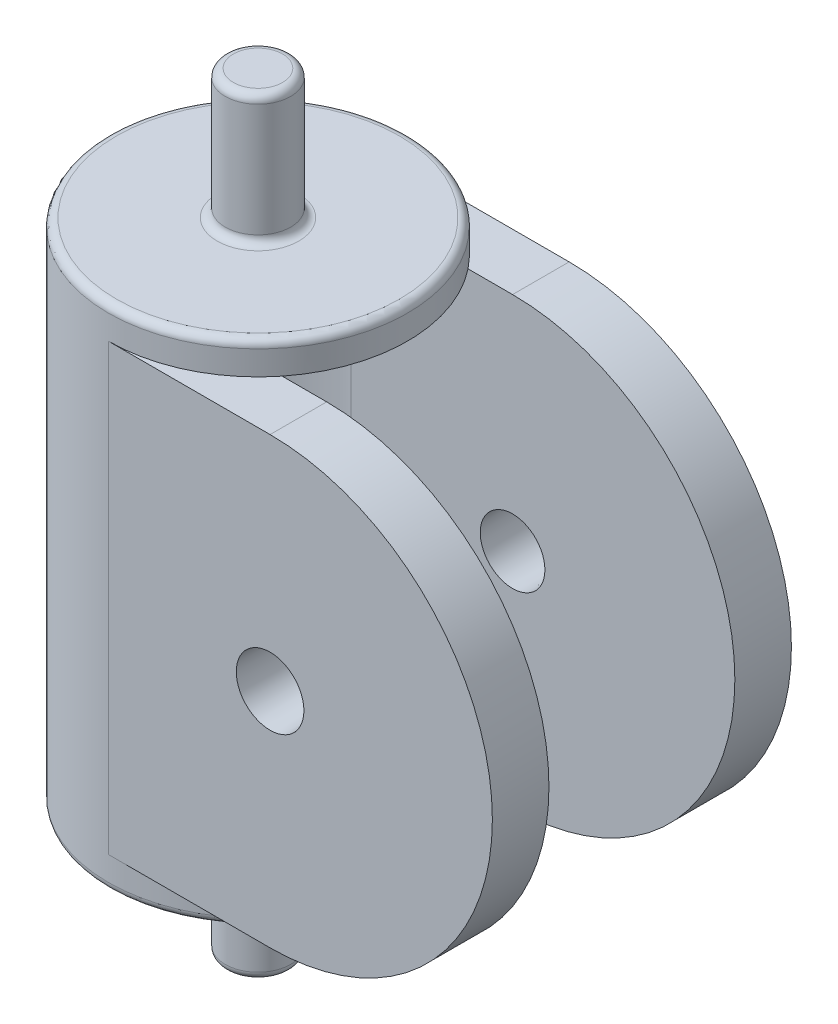
ISO-10303-21;
HEADER;
FILE_DESCRIPTION(('STEP AP214'),'2;1');
FILE_NAME('part.step','',(''),(''),'','','');
FILE_SCHEMA(('AUTOMOTIVE_DESIGN { 1 0 10303 214 1 1 1 1 }'));
ENDSEC;
DATA;
#1=APPLICATION_CONTEXT('core data for automotive mechanical design processes');
#2=APPLICATION_PROTOCOL_DEFINITION('international standard','automotive_design',2000,#1);
#3=PRODUCT_CONTEXT('',#1,'mechanical');
#4=PRODUCT('Part','Part','',(#3));
#5=PRODUCT_RELATED_PRODUCT_CATEGORY('part','',(#4));
#6=PRODUCT_DEFINITION_FORMATION('','',#4);
#7=PRODUCT_DEFINITION_CONTEXT('part definition',#1,'design');
#8=PRODUCT_DEFINITION('design','',#6,#7);
#9=PRODUCT_DEFINITION_SHAPE('','',#8);
#10=(LENGTH_UNIT() NAMED_UNIT(*) SI_UNIT(.MILLI.,.METRE.));
#11=(NAMED_UNIT(*) PLANE_ANGLE_UNIT() SI_UNIT($,.RADIAN.));
#12=(NAMED_UNIT(*) SI_UNIT($,.STERADIAN.) SOLID_ANGLE_UNIT());
#13=UNCERTAINTY_MEASURE_WITH_UNIT(LENGTH_MEASURE(1.E-05),#10,'distance_accuracy_value','');
#14=(GEOMETRIC_REPRESENTATION_CONTEXT(3) GLOBAL_UNCERTAINTY_ASSIGNED_CONTEXT((#13)) GLOBAL_UNIT_ASSIGNED_CONTEXT((#10,
#11,#12)) REPRESENTATION_CONTEXT('',''));
#15=CARTESIAN_POINT('',(0.,0.,0.));
#16=DIRECTION('',(0.,0.,1.));
#17=DIRECTION('',(1.,0.,0.));
#18=AXIS2_PLACEMENT_3D('',#15,#16,#17);
#19=CARTESIAN_POINT('',(20.,0.,18.5));
#20=DIRECTION('',(0.,1.,0.));
#21=DIRECTION('',(0.,0.,1.));
#22=AXIS2_PLACEMENT_3D('',#19,#20,#21);
#23=PLANE('',#22);
#24=CARTESIAN_POINT('',(0.,0.,0.));
#25=DIRECTION('',(0.,-1.,0.));
#26=DIRECTION('',(0.,0.,-1.));
#27=AXIS2_PLACEMENT_3D('',#24,#25,#26);
#28=CIRCLE('',#27,18.5);
#29=CARTESIAN_POINT('',(0.,0.,-18.5));
#30=VERTEX_POINT('',#29);
#31=CARTESIAN_POINT('',(14.4913767461894,0.,-11.5));
#32=VERTEX_POINT('',#31);
#33=EDGE_CURVE('E54',#30,#32,#28,.T.);
#34=ORIENTED_EDGE('',*,*,#33,.F.);
#35=DIRECTION('',(1.,0.,0.));
#36=VECTOR('',#35,1.);
#37=CARTESIAN_POINT('',(20.,0.,-18.5));
#38=LINE('',#37,#36);
#39=CARTESIAN_POINT('',(20.,0.,-18.5));
#40=VERTEX_POINT('',#39);
#41=EDGE_CURVE('E120',#30,#40,#38,.T.);
#42=ORIENTED_EDGE('',*,*,#41,.T.);
#43=DIRECTION('',(0.,0.,1.));
#44=VECTOR('',#43,1.);
#45=CARTESIAN_POINT('',(20.,0.,-18.5));
#46=LINE('',#45,#44);
#47=CARTESIAN_POINT('',(20.,0.,-11.5));
#48=VERTEX_POINT('',#47);
#49=EDGE_CURVE('E143',#40,#48,#46,.T.);
#50=ORIENTED_EDGE('',*,*,#49,.T.);
#51=DIRECTION('',(1.,0.,0.));
#52=VECTOR('',#51,1.);
#53=CARTESIAN_POINT('',(0.,0.,-11.5));
#54=LINE('',#53,#52);
#55=EDGE_CURVE('E121',#32,#48,#54,.T.);
#56=ORIENTED_EDGE('',*,*,#55,.F.);
#57=EDGE_LOOP('',(#34,#42,#50,#56));
#58=FACE_BOUND('',#57,.T.);
#59=ADVANCED_FACE('F39',(#58),#23,.F.);
#60=CARTESIAN_POINT('',(0.,55.,18.5));
#61=DIRECTION('',(0.,-1.,0.));
#62=DIRECTION('',(0.,0.,-1.));
#63=AXIS2_PLACEMENT_3D('',#60,#61,#62);
#64=PLANE('',#63);
#65=CARTESIAN_POINT('',(0.,55.,0.));
#66=DIRECTION('',(0.,1.,0.));
#67=DIRECTION('',(0.,0.,1.));
#68=AXIS2_PLACEMENT_3D('',#65,#66,#67);
#69=CIRCLE('',#68,18.5);
#70=CARTESIAN_POINT('',(0.,55.,18.5));
#71=VERTEX_POINT('',#70);
#72=CARTESIAN_POINT('',(14.4913767461894,55.,11.5));
#73=VERTEX_POINT('',#72);
#74=EDGE_CURVE('E274',#71,#73,#69,.T.);
#75=ORIENTED_EDGE('',*,*,#74,.F.);
#76=DIRECTION('',(-1.,0.,0.));
#77=VECTOR('',#76,1.);
#78=CARTESIAN_POINT('',(0.,55.,18.5));
#79=LINE('',#78,#77);
#80=CARTESIAN_POINT('',(20.,55.,18.5));
#81=VERTEX_POINT('',#80);
#82=EDGE_CURVE('E176',#81,#71,#79,.T.);
#83=ORIENTED_EDGE('',*,*,#82,.F.);
#84=DIRECTION('',(0.,0.,-1.));
#85=VECTOR('',#84,1.);
#86=CARTESIAN_POINT('',(20.,55.,18.5));
#87=LINE('',#86,#85);
#88=CARTESIAN_POINT('',(20.,55.,11.5));
#89=VERTEX_POINT('',#88);
#90=EDGE_CURVE('E182',#81,#89,#87,.T.);
#91=ORIENTED_EDGE('',*,*,#90,.T.);
#92=DIRECTION('',(-1.,0.,0.));
#93=VECTOR('',#92,1.);
#94=CARTESIAN_POINT('',(0.,55.,11.5));
#95=LINE('',#94,#93);
#96=EDGE_CURVE('E187',#89,#73,#95,.T.);
#97=ORIENTED_EDGE('',*,*,#96,.T.);
#98=EDGE_LOOP('',(#75,#83,#91,#97));
#99=FACE_BOUND('',#98,.T.);
#100=ADVANCED_FACE('F240',(#99),#64,.F.);
#101=CARTESIAN_POINT('',(0.,0.,0.));
#102=DIRECTION('',(0.,1.,0.));
#103=DIRECTION('',(-1.,0.,0.));
#104=AXIS2_PLACEMENT_3D('',#101,#102,#103);
#105=CYLINDRICAL_SURFACE('',#104,18.5);
#106=CARTESIAN_POINT('',(0.,-3.,0.));
#107=DIRECTION('',(0.,-1.,0.));
#108=DIRECTION('',(0.,0.,-1.));
#109=AXIS2_PLACEMENT_3D('',#106,#107,#108);
#110=CIRCLE('',#109,18.5);
#111=CARTESIAN_POINT('',(0.,-3.,-18.5));
#112=VERTEX_POINT('',#111);
#113=EDGE_CURVE('E11',#112,#112,#110,.F.);
#114=ORIENTED_EDGE('',*,*,#113,.T.);
#115=EDGE_LOOP('',(#114));
#116=FACE_BOUND('',#115,.T.);
#117=CARTESIAN_POINT('',(0.,58.,0.));
#118=DIRECTION('',(0.,1.,0.));
#119=DIRECTION('',(0.,0.,1.));
#120=AXIS2_PLACEMENT_3D('',#117,#118,#119);
#121=CIRCLE('',#120,18.5);
#122=CARTESIAN_POINT('',(0.,58.,18.5));
#123=VERTEX_POINT('',#122);
#124=EDGE_CURVE('E202',#123,#123,#121,.F.);
#125=ORIENTED_EDGE('',*,*,#124,.T.);
#126=EDGE_LOOP('',(#125));
#127=FACE_BOUND('',#126,.T.);
#128=DIRECTION('',(0.,-1.,0.));
#129=VECTOR('',#128,1.);
#130=CARTESIAN_POINT('',(0.,0.,18.5));
#131=LINE('',#130,#129);
#132=CARTESIAN_POINT('',(0.,0.,18.5));
#133=VERTEX_POINT('',#132);
#134=EDGE_CURVE('E179',#71,#133,#131,.T.);
#135=ORIENTED_EDGE('',*,*,#134,.F.);
#136=ORIENTED_EDGE('',*,*,#74,.T.);
#137=CARTESIAN_POINT('',(14.4913767461894,55.,-11.5));
#138=VERTEX_POINT('',#137);
#139=EDGE_CURVE('E276',#73,#138,#69,.T.);
#140=ORIENTED_EDGE('',*,*,#139,.T.);
#141=CARTESIAN_POINT('',(0.,55.,-18.5));
#142=VERTEX_POINT('',#141);
#143=EDGE_CURVE('E142',#138,#142,#69,.T.);
#144=ORIENTED_EDGE('',*,*,#143,.T.);
#145=DIRECTION('',(0.,-1.,0.));
#146=VECTOR('',#145,1.);
#147=CARTESIAN_POINT('',(0.,0.,-18.5));
#148=LINE('',#147,#146);
#149=EDGE_CURVE('E132',#142,#30,#148,.T.);
#150=ORIENTED_EDGE('',*,*,#149,.T.);
#151=ORIENTED_EDGE('',*,*,#33,.T.);
#152=CARTESIAN_POINT('',(14.4913767461894,0.,11.5));
#153=VERTEX_POINT('',#152);
#154=EDGE_CURVE('E124',#32,#153,#28,.T.);
#155=ORIENTED_EDGE('',*,*,#154,.T.);
#156=EDGE_CURVE('E126',#153,#133,#28,.T.);
#157=ORIENTED_EDGE('',*,*,#156,.T.);
#158=EDGE_LOOP('',(#135,#136,#140,#144,#150,#151,#155,#157));
#159=FACE_BOUND('',#158,.T.);
#160=ADVANCED_FACE('F139',(#116,#127,#159),#105,.T.);
#161=ORIENTED_EDGE('',*,*,#156,.F.);
#162=DIRECTION('',(1.,0.,0.));
#163=VECTOR('',#162,1.);
#164=CARTESIAN_POINT('',(20.,0.,11.5));
#165=LINE('',#164,#163);
#166=CARTESIAN_POINT('',(20.,0.,11.5));
#167=VERTEX_POINT('',#166);
#168=EDGE_CURVE('E169',#153,#167,#165,.T.);
#169=ORIENTED_EDGE('',*,*,#168,.T.);
#170=DIRECTION('',(0.,0.,-1.));
#171=VECTOR('',#170,1.);
#172=CARTESIAN_POINT('',(20.,0.,18.5));
#173=LINE('',#172,#171);
#174=CARTESIAN_POINT('',(20.,0.,18.5));
#175=VERTEX_POINT('',#174);
#176=EDGE_CURVE('E193',#175,#167,#173,.T.);
#177=ORIENTED_EDGE('',*,*,#176,.F.);
#178=DIRECTION('',(1.,0.,0.));
#179=VECTOR('',#178,1.);
#180=CARTESIAN_POINT('',(20.,0.,18.5));
#181=LINE('',#180,#179);
#182=EDGE_CURVE('E170',#133,#175,#181,.T.);
#183=ORIENTED_EDGE('',*,*,#182,.F.);
#184=EDGE_LOOP('',(#161,#169,#177,#183));
#185=FACE_BOUND('',#184,.T.);
#186=ADVANCED_FACE('F242',(#185),#23,.F.);
#187=CARTESIAN_POINT('',(20.,27.5,18.5));
#188=DIRECTION('',(0.,0.,-1.));
#189=DIRECTION('',(-1.,0.,0.));
#190=AXIS2_PLACEMENT_3D('',#187,#188,#189);
#191=CYLINDRICAL_SURFACE('',#190,27.5);
#192=CARTESIAN_POINT('',(20.,27.5,11.5));
#193=DIRECTION('',(0.,0.,1.));
#194=DIRECTION('',(1.,0.,0.));
#195=AXIS2_PLACEMENT_3D('',#192,#193,#194);
#196=CIRCLE('',#195,27.5);
#197=EDGE_CURVE('E185',#167,#89,#196,.T.);
#198=ORIENTED_EDGE('',*,*,#197,.T.);
#199=ORIENTED_EDGE('',*,*,#90,.F.);
#200=CARTESIAN_POINT('',(20.,27.5,18.5));
#201=DIRECTION('',(0.,0.,1.));
#202=DIRECTION('',(1.,0.,0.));
#203=AXIS2_PLACEMENT_3D('',#200,#201,#202);
#204=CIRCLE('',#203,27.5);
#205=EDGE_CURVE('E173',#175,#81,#204,.T.);
#206=ORIENTED_EDGE('',*,*,#205,.F.);
#207=ORIENTED_EDGE('',*,*,#176,.T.);
#208=EDGE_LOOP('',(#198,#199,#206,#207));
#209=FACE_BOUND('',#208,.T.);
#210=ADVANCED_FACE('F252',(#209),#191,.T.);
#211=ORIENTED_EDGE('',*,*,#143,.F.);
#212=DIRECTION('',(1.,0.,0.));
#213=VECTOR('',#212,1.);
#214=CARTESIAN_POINT('',(0.,55.,-11.5));
#215=LINE('',#214,#213);
#216=CARTESIAN_POINT('',(20.,55.,-11.5));
#217=VERTEX_POINT('',#216);
#218=EDGE_CURVE('E165',#138,#217,#215,.T.);
#219=ORIENTED_EDGE('',*,*,#218,.T.);
#220=DIRECTION('',(0.,0.,1.));
#221=VECTOR('',#220,1.);
#222=CARTESIAN_POINT('',(20.,55.,-18.5));
#223=LINE('',#222,#221);
#224=CARTESIAN_POINT('',(20.,55.,-18.5));
#225=VERTEX_POINT('',#224);
#226=EDGE_CURVE('E146',#225,#217,#223,.T.);
#227=ORIENTED_EDGE('',*,*,#226,.F.);
#228=DIRECTION('',(-1.,0.,0.));
#229=VECTOR('',#228,1.);
#230=CARTESIAN_POINT('',(0.,55.,-18.5));
#231=LINE('',#230,#229);
#232=EDGE_CURVE('E144',#225,#142,#231,.T.);
#233=ORIENTED_EDGE('',*,*,#232,.T.);
#234=EDGE_LOOP('',(#211,#219,#227,#233));
#235=FACE_BOUND('',#234,.T.);
#236=ADVANCED_FACE('F248',(#235),#64,.F.);
#237=CARTESIAN_POINT('',(20.,27.5,18.5));
#238=DIRECTION('',(0.,0.,1.));
#239=DIRECTION('',(1.,0.,0.));
#240=AXIS2_PLACEMENT_3D('',#237,#238,#239);
#241=PLANE('',#240);
#242=CARTESIAN_POINT('',(20.,27.5,18.5));
#243=DIRECTION('',(0.,0.,1.));
#244=DIRECTION('',(1.,0.,0.));
#245=AXIS2_PLACEMENT_3D('',#242,#243,#244);
#246=CIRCLE('',#245,4.18330145098431);
#247=CARTESIAN_POINT('',(24.1833014509843,27.5,18.5));
#248=VERTEX_POINT('',#247);
#249=EDGE_CURVE('E280',#248,#248,#246,.T.);
#250=ORIENTED_EDGE('',*,*,#249,.F.);
#251=EDGE_LOOP('',(#250));
#252=FACE_BOUND('',#251,.T.);
#253=ORIENTED_EDGE('',*,*,#182,.T.);
#254=ORIENTED_EDGE('',*,*,#205,.T.);
#255=ORIENTED_EDGE('',*,*,#82,.T.);
#256=ORIENTED_EDGE('',*,*,#134,.T.);
#257=EDGE_LOOP('',(#253,#254,#255,#256));
#258=FACE_BOUND('',#257,.T.);
#259=ADVANCED_FACE('F272',(#252,#258),#241,.T.);
#260=CARTESIAN_POINT('',(20.,27.5,11.5));
#261=DIRECTION('',(0.,0.,1.));
#262=DIRECTION('',(1.,0.,0.));
#263=AXIS2_PLACEMENT_3D('',#260,#261,#262);
#264=PLANE('',#263);
#265=CARTESIAN_POINT('',(20.,27.5,11.5));
#266=DIRECTION('',(0.,0.,-1.));
#267=DIRECTION('',(-1.,0.,0.));
#268=AXIS2_PLACEMENT_3D('',#265,#266,#267);
#269=CIRCLE('',#268,4.);
#270=CARTESIAN_POINT('',(16.,27.5,11.5));
#271=VERTEX_POINT('',#270);
#272=EDGE_CURVE('E282',#271,#271,#269,.T.);
#273=ORIENTED_EDGE('',*,*,#272,.F.);
#274=EDGE_LOOP('',(#273));
#275=FACE_BOUND('',#274,.T.);
#276=ORIENTED_EDGE('',*,*,#197,.F.);
#277=ORIENTED_EDGE('',*,*,#168,.F.);
#278=CARTESIAN_POINT('',(0.,0.,11.5));
#279=VERTEX_POINT('',#278);
#280=EDGE_CURVE('E183',#279,#153,#165,.T.);
#281=ORIENTED_EDGE('',*,*,#280,.F.);
#282=DIRECTION('',(0.,-1.,0.));
#283=VECTOR('',#282,1.);
#284=CARTESIAN_POINT('',(0.,0.,11.5));
#285=LINE('',#284,#283);
#286=CARTESIAN_POINT('',(0.,55.,11.5));
#287=VERTEX_POINT('',#286);
#288=EDGE_CURVE('E174',#287,#279,#285,.T.);
#289=ORIENTED_EDGE('',*,*,#288,.F.);
#290=DIRECTION('',(-1.,0.,0.));
#291=VECTOR('',#290,1.);
#292=CARTESIAN_POINT('',(20.,55.,11.5));
#293=LINE('',#292,#291);
#294=EDGE_CURVE('E62',#73,#287,#293,.T.);
#295=ORIENTED_EDGE('',*,*,#294,.F.);
#296=ORIENTED_EDGE('',*,*,#96,.F.);
#297=EDGE_LOOP('',(#276,#277,#281,#289,#295,#296));
#298=FACE_BOUND('',#297,.T.);
#299=ADVANCED_FACE('F268',(#275,#298),#264,.F.);
#300=CARTESIAN_POINT('',(0.,0.,0.));
#301=DIRECTION('',(0.,1.,0.));
#302=DIRECTION('',(-1.,0.,0.));
#303=AXIS2_PLACEMENT_3D('',#300,#301,#302);
#304=CYLINDRICAL_SURFACE('',#303,11.5);
#305=CARTESIAN_POINT('',(0.,55.,0.));
#306=DIRECTION('',(0.,-1.,0.));
#307=DIRECTION('',(-1.,0.,0.));
#308=AXIS2_PLACEMENT_3D('',#305,#306,#307);
#309=CIRCLE('',#308,11.5);
#310=CARTESIAN_POINT('',(0.,55.,-11.5));
#311=VERTEX_POINT('',#310);
#312=EDGE_CURVE('E154',#287,#311,#309,.T.);
#313=ORIENTED_EDGE('',*,*,#312,.F.);
#314=ORIENTED_EDGE('',*,*,#288,.T.);
#315=CARTESIAN_POINT('',(0.,0.,0.));
#316=DIRECTION('',(0.,-1.,0.));
#317=DIRECTION('',(-1.,0.,0.));
#318=AXIS2_PLACEMENT_3D('',#315,#316,#317);
#319=CIRCLE('',#318,11.5);
#320=CARTESIAN_POINT('',(0.,0.,-11.5));
#321=VERTEX_POINT('',#320);
#322=EDGE_CURVE('E156',#279,#321,#319,.T.);
#323=ORIENTED_EDGE('',*,*,#322,.T.);
#324=DIRECTION('',(0.,1.,0.));
#325=VECTOR('',#324,1.);
#326=CARTESIAN_POINT('',(0.,0.,-11.5));
#327=LINE('',#326,#325);
#328=EDGE_CURVE('E162',#321,#311,#327,.T.);
#329=ORIENTED_EDGE('',*,*,#328,.T.);
#330=EDGE_LOOP('',(#313,#314,#323,#329));
#331=FACE_BOUND('',#330,.T.);
#332=ADVANCED_FACE('F357',(#331),#304,.F.);
#333=CARTESIAN_POINT('',(0.,0.,-11.5));
#334=DIRECTION('',(0.,0.,1.));
#335=DIRECTION('',(1.,0.,0.));
#336=AXIS2_PLACEMENT_3D('',#333,#334,#335);
#337=PLANE('',#336);
#338=EDGE_CURVE('E159',#311,#138,#215,.T.);
#339=ORIENTED_EDGE('',*,*,#338,.F.);
#340=ORIENTED_EDGE('',*,*,#328,.F.);
#341=EDGE_CURVE('E160',#321,#32,#54,.T.);
#342=ORIENTED_EDGE('',*,*,#341,.T.);
#343=ORIENTED_EDGE('',*,*,#55,.T.);
#344=CARTESIAN_POINT('',(20.,27.5,-11.5));
#345=DIRECTION('',(0.,0.,1.));
#346=DIRECTION('',(1.,0.,0.));
#347=AXIS2_PLACEMENT_3D('',#344,#345,#346);
#348=CIRCLE('',#347,27.5);
#349=EDGE_CURVE('E136',#48,#217,#348,.T.);
#350=ORIENTED_EDGE('',*,*,#349,.T.);
#351=ORIENTED_EDGE('',*,*,#218,.F.);
#352=EDGE_LOOP('',(#339,#340,#342,#343,#350,#351));
#353=FACE_BOUND('',#352,.T.);
#354=CARTESIAN_POINT('',(20.,27.5,-11.5));
#355=DIRECTION('',(0.,0.,1.));
#356=DIRECTION('',(1.,0.,0.));
#357=AXIS2_PLACEMENT_3D('',#354,#355,#356);
#358=CIRCLE('',#357,4.);
#359=CARTESIAN_POINT('',(24.,27.5,-11.5));
#360=VERTEX_POINT('',#359);
#361=EDGE_CURVE('E123',#360,#360,#358,.T.);
#362=ORIENTED_EDGE('',*,*,#361,.F.);
#363=EDGE_LOOP('',(#362));
#364=FACE_BOUND('',#363,.T.);
#365=ADVANCED_FACE('F352',(#353,#364),#337,.T.);
#366=CARTESIAN_POINT('',(20.,27.5,-18.5));
#367=DIRECTION('',(0.,0.,1.));
#368=DIRECTION('',(1.,0.,0.));
#369=AXIS2_PLACEMENT_3D('',#366,#367,#368);
#370=CYLINDRICAL_SURFACE('',#369,27.5);
#371=ORIENTED_EDGE('',*,*,#349,.F.);
#372=ORIENTED_EDGE('',*,*,#49,.F.);
#373=CARTESIAN_POINT('',(20.,27.5,-18.5));
#374=DIRECTION('',(0.,0.,1.));
#375=DIRECTION('',(1.,0.,0.));
#376=AXIS2_PLACEMENT_3D('',#373,#374,#375);
#377=CIRCLE('',#376,27.5);
#378=EDGE_CURVE('E135',#40,#225,#377,.T.);
#379=ORIENTED_EDGE('',*,*,#378,.T.);
#380=ORIENTED_EDGE('',*,*,#226,.T.);
#381=EDGE_LOOP('',(#371,#372,#379,#380));
#382=FACE_BOUND('',#381,.T.);
#383=ADVANCED_FACE('F349',(#382),#370,.T.);
#384=CARTESIAN_POINT('',(20.,27.5,-18.5));
#385=DIRECTION('',(0.,0.,1.));
#386=DIRECTION('',(1.,0.,0.));
#387=AXIS2_PLACEMENT_3D('',#384,#385,#386);
#388=PLANE('',#387);
#389=CARTESIAN_POINT('',(20.,27.5,-18.5));
#390=DIRECTION('',(0.,0.,1.));
#391=DIRECTION('',(1.,0.,0.));
#392=AXIS2_PLACEMENT_3D('',#389,#390,#391);
#393=CIRCLE('',#392,4.18330145098431);
#394=CARTESIAN_POINT('',(24.1833014509843,27.5,-18.5));
#395=VERTEX_POINT('',#394);
#396=EDGE_CURVE('E286',#395,#395,#393,.T.);
#397=ORIENTED_EDGE('',*,*,#396,.T.);
#398=EDGE_LOOP('',(#397));
#399=FACE_BOUND('',#398,.T.);
#400=ORIENTED_EDGE('',*,*,#41,.F.);
#401=ORIENTED_EDGE('',*,*,#149,.F.);
#402=ORIENTED_EDGE('',*,*,#232,.F.);
#403=ORIENTED_EDGE('',*,*,#378,.F.);
#404=EDGE_LOOP('',(#400,#401,#402,#403));
#405=FACE_BOUND('',#404,.T.);
#406=ADVANCED_FACE('F130',(#399,#405),#388,.F.);
#407=CARTESIAN_POINT('',(0.,55.,0.));
#408=DIRECTION('',(0.,1.,0.));
#409=DIRECTION('',(0.,0.,1.));
#410=AXIS2_PLACEMENT_3D('',#407,#408,#409);
#411=PLANE('',#410);
#412=ORIENTED_EDGE('',*,*,#139,.F.);
#413=ORIENTED_EDGE('',*,*,#294,.T.);
#414=ORIENTED_EDGE('',*,*,#312,.T.);
#415=ORIENTED_EDGE('',*,*,#338,.T.);
#416=EDGE_LOOP('',(#412,#413,#414,#415));
#417=FACE_BOUND('',#416,.T.);
#418=ADVANCED_FACE('F342',(#417),#411,.F.);
#419=CARTESIAN_POINT('',(0.,59.,0.));
#420=DIRECTION('',(0.,1.,0.));
#421=DIRECTION('',(0.,0.,1.));
#422=AXIS2_PLACEMENT_3D('',#419,#420,#421);
#423=PLANE('',#422);
#424=CARTESIAN_POINT('',(0.,59.,0.));
#425=DIRECTION('',(0.,1.,0.));
#426=DIRECTION('',(0.,0.,1.));
#427=AXIS2_PLACEMENT_3D('',#424,#425,#426);
#428=CIRCLE('',#427,17.5);
#429=CARTESIAN_POINT('',(0.,59.,17.5));
#430=VERTEX_POINT('',#429);
#431=EDGE_CURVE('E199',#430,#430,#428,.T.);
#432=ORIENTED_EDGE('',*,*,#431,.T.);
#433=EDGE_LOOP('',(#432));
#434=FACE_BOUND('',#433,.T.);
#435=CARTESIAN_POINT('',(0.,59.,0.));
#436=DIRECTION('',(0.,1.,0.));
#437=DIRECTION('',(0.,0.,1.));
#438=AXIS2_PLACEMENT_3D('',#435,#436,#437);
#439=CIRCLE('',#438,5.05);
#440=CARTESIAN_POINT('',(0.,59.,5.05));
#441=VERTEX_POINT('',#440);
#442=EDGE_CURVE('E196',#441,#441,#439,.F.);
#443=ORIENTED_EDGE('',*,*,#442,.T.);
#444=EDGE_LOOP('',(#443));
#445=FACE_BOUND('',#444,.T.);
#446=ADVANCED_FACE('F338',(#434,#445),#423,.T.);
#447=CARTESIAN_POINT('',(0.,75.,0.));
#448=DIRECTION('',(0.,-1.,0.));
#449=DIRECTION('',(0.,0.,-1.));
#450=AXIS2_PLACEMENT_3D('',#447,#448,#449);
#451=CYLINDRICAL_SURFACE('',#450,4.05);
#452=CARTESIAN_POINT('',(0.,60.,0.));
#453=DIRECTION('',(0.,1.,0.));
#454=DIRECTION('',(0.,0.,1.));
#455=AXIS2_PLACEMENT_3D('',#452,#453,#454);
#456=CIRCLE('',#455,4.05);
#457=CARTESIAN_POINT('',(0.,60.,4.05));
#458=VERTEX_POINT('',#457);
#459=EDGE_CURVE('E208',#458,#458,#456,.T.);
#460=ORIENTED_EDGE('',*,*,#459,.T.);
#461=EDGE_LOOP('',(#460));
#462=FACE_BOUND('',#461,.T.);
#463=CARTESIAN_POINT('',(0.,74.,0.));
#464=DIRECTION('',(0.,1.,0.));
#465=DIRECTION('',(0.,0.,1.));
#466=AXIS2_PLACEMENT_3D('',#463,#464,#465);
#467=CIRCLE('',#466,4.05);
#468=CARTESIAN_POINT('',(0.,74.,4.05));
#469=VERTEX_POINT('',#468);
#470=EDGE_CURVE('E205',#469,#469,#467,.F.);
#471=ORIENTED_EDGE('',*,*,#470,.T.);
#472=EDGE_LOOP('',(#471));
#473=FACE_BOUND('',#472,.T.);
#474=ADVANCED_FACE('F334',(#462,#473),#451,.T.);
#475=CARTESIAN_POINT('',(0.,75.,0.));
#476=DIRECTION('',(0.,1.,0.));
#477=DIRECTION('',(0.,0.,1.));
#478=AXIS2_PLACEMENT_3D('',#475,#476,#477);
#479=PLANE('',#478);
#480=CARTESIAN_POINT('',(0.,75.,0.));
#481=DIRECTION('',(0.,1.,0.));
#482=DIRECTION('',(0.,0.,1.));
#483=AXIS2_PLACEMENT_3D('',#480,#481,#482);
#484=CIRCLE('',#483,3.05);
#485=CARTESIAN_POINT('',(0.,75.,3.05));
#486=VERTEX_POINT('',#485);
#487=EDGE_CURVE('E211',#486,#486,#484,.T.);
#488=ORIENTED_EDGE('',*,*,#487,.T.);
#489=EDGE_LOOP('',(#488));
#490=FACE_BOUND('',#489,.T.);
#491=ADVANCED_FACE('F330',(#490),#479,.T.);
#492=CARTESIAN_POINT('',(0.,58.,0.));
#493=DIRECTION('',(0.,1.,0.));
#494=DIRECTION('',(0.,0.,1.));
#495=AXIS2_PLACEMENT_3D('',#492,#493,#494);
#496=TOROIDAL_SURFACE('',#495,17.5,1.);
#497=ORIENTED_EDGE('',*,*,#124,.F.);
#498=EDGE_LOOP('',(#497));
#499=FACE_BOUND('',#498,.T.);
#500=ORIENTED_EDGE('',*,*,#431,.F.);
#501=EDGE_LOOP('',(#500));
#502=FACE_BOUND('',#501,.T.);
#503=ADVANCED_FACE('F333',(#499,#502),#496,.T.);
#504=CARTESIAN_POINT('',(0.,60.,0.));
#505=DIRECTION('',(0.,1.,0.));
#506=DIRECTION('',(0.,0.,1.));
#507=AXIS2_PLACEMENT_3D('',#504,#505,#506);
#508=TOROIDAL_SURFACE('',#507,5.05,1.);
#509=ORIENTED_EDGE('',*,*,#459,.F.);
#510=EDGE_LOOP('',(#509));
#511=FACE_BOUND('',#510,.T.);
#512=ORIENTED_EDGE('',*,*,#442,.F.);
#513=EDGE_LOOP('',(#512));
#514=FACE_BOUND('',#513,.T.);
#515=ADVANCED_FACE('F429',(#511,#514),#508,.F.);
#516=CARTESIAN_POINT('',(0.,74.,0.));
#517=DIRECTION('',(0.,1.,0.));
#518=DIRECTION('',(0.,0.,1.));
#519=AXIS2_PLACEMENT_3D('',#516,#517,#518);
#520=TOROIDAL_SURFACE('',#519,3.05,1.);
#521=ORIENTED_EDGE('',*,*,#470,.F.);
#522=EDGE_LOOP('',(#521));
#523=FACE_BOUND('',#522,.T.);
#524=ORIENTED_EDGE('',*,*,#487,.F.);
#525=EDGE_LOOP('',(#524));
#526=FACE_BOUND('',#525,.T.);
#527=ADVANCED_FACE('F329',(#523,#526),#520,.T.);
#528=CARTESIAN_POINT('',(20.,27.5,11.5));
#529=DIRECTION('',(0.,0.,1.));
#530=DIRECTION('',(-1.,0.,0.));
#531=AXIS2_PLACEMENT_3D('',#528,#529,#530);
#532=CONICAL_SURFACE('',#531,4.,0.026179938779915);
#533=ORIENTED_EDGE('',*,*,#249,.T.);
#534=EDGE_LOOP('',(#533));
#535=FACE_BOUND('',#534,.T.);
#536=ORIENTED_EDGE('',*,*,#272,.T.);
#537=EDGE_LOOP('',(#536));
#538=FACE_BOUND('',#537,.T.);
#539=ADVANCED_FACE('F325',(#535,#538),#532,.F.);
#540=CARTESIAN_POINT('',(20.,27.5,-11.5));
#541=DIRECTION('',(0.,0.,-1.));
#542=DIRECTION('',(1.,0.,0.));
#543=AXIS2_PLACEMENT_3D('',#540,#541,#542);
#544=CONICAL_SURFACE('',#543,4.,0.026179938779915);
#545=ORIENTED_EDGE('',*,*,#361,.T.);
#546=EDGE_LOOP('',(#545));
#547=FACE_BOUND('',#546,.T.);
#548=ORIENTED_EDGE('',*,*,#396,.F.);
#549=EDGE_LOOP('',(#548));
#550=FACE_BOUND('',#549,.T.);
#551=ADVANCED_FACE('F322',(#547,#550),#544,.F.);
#552=CARTESIAN_POINT('',(0.,0.,0.));
#553=DIRECTION('',(0.,-1.,0.));
#554=DIRECTION('',(0.,0.,-1.));
#555=AXIS2_PLACEMENT_3D('',#552,#553,#554);
#556=PLANE('',#555);
#557=CARTESIAN_POINT('',(0.,0.,0.));
#558=DIRECTION('',(0.,-1.,0.));
#559=DIRECTION('',(0.,0.,-1.));
#560=AXIS2_PLACEMENT_3D('',#557,#558,#559);
#561=CIRCLE('',#560,2.25);
#562=CARTESIAN_POINT('',(0.,0.,-2.25));
#563=VERTEX_POINT('',#562);
#564=EDGE_CURVE('E266',#563,#563,#561,.T.);
#565=ORIENTED_EDGE('',*,*,#564,.T.);
#566=EDGE_LOOP('',(#565));
#567=FACE_BOUND('',#566,.T.);
#568=ORIENTED_EDGE('',*,*,#322,.F.);
#569=ORIENTED_EDGE('',*,*,#280,.T.);
#570=ORIENTED_EDGE('',*,*,#154,.F.);
#571=ORIENTED_EDGE('',*,*,#341,.F.);
#572=EDGE_LOOP('',(#568,#569,#570,#571));
#573=FACE_BOUND('',#572,.T.);
#574=ADVANCED_FACE('F301',(#567,#573),#556,.F.);
#575=CARTESIAN_POINT('',(0.,-4.,0.));
#576=DIRECTION('',(0.,-1.,0.));
#577=DIRECTION('',(0.,0.,-1.));
#578=AXIS2_PLACEMENT_3D('',#575,#576,#577);
#579=PLANE('',#578);
#580=CARTESIAN_POINT('',(0.,-4.,0.));
#581=DIRECTION('',(0.,-1.,0.));
#582=DIRECTION('',(0.,0.,-1.));
#583=AXIS2_PLACEMENT_3D('',#580,#581,#582);
#584=CIRCLE('',#583,17.5);
#585=CARTESIAN_POINT('',(0.,-4.,-17.5));
#586=VERTEX_POINT('',#585);
#587=EDGE_CURVE('E47',#586,#586,#584,.T.);
#588=ORIENTED_EDGE('',*,*,#587,.T.);
#589=EDGE_LOOP('',(#588));
#590=FACE_BOUND('',#589,.T.);
#591=CARTESIAN_POINT('',(0.,-4.,0.));
#592=DIRECTION('',(0.,-1.,0.));
#593=DIRECTION('',(0.,0.,-1.));
#594=AXIS2_PLACEMENT_3D('',#591,#592,#593);
#595=CIRCLE('',#594,4.05);
#596=CARTESIAN_POINT('',(0.,-4.,-4.05));
#597=VERTEX_POINT('',#596);
#598=EDGE_CURVE('E214',#597,#597,#595,.T.);
#599=ORIENTED_EDGE('',*,*,#598,.F.);
#600=EDGE_LOOP('',(#599));
#601=FACE_BOUND('',#600,.T.);
#602=ADVANCED_FACE('F223',(#590,#601),#579,.T.);
#603=CARTESIAN_POINT('',(0.,-20.,0.));
#604=DIRECTION('',(0.,1.,0.));
#605=DIRECTION('',(0.,0.,1.));
#606=AXIS2_PLACEMENT_3D('',#603,#604,#605);
#607=CYLINDRICAL_SURFACE('',#606,4.05);
#608=CARTESIAN_POINT('',(0.,-19.,0.));
#609=DIRECTION('',(0.,-1.,0.));
#610=DIRECTION('',(0.,0.,-1.));
#611=AXIS2_PLACEMENT_3D('',#608,#609,#610);
#612=CIRCLE('',#611,4.05);
#613=CARTESIAN_POINT('',(0.,-19.,-4.05));
#614=VERTEX_POINT('',#613);
#615=EDGE_CURVE('E218',#614,#614,#612,.F.);
#616=ORIENTED_EDGE('',*,*,#615,.T.);
#617=EDGE_LOOP('',(#616));
#618=FACE_BOUND('',#617,.T.);
#619=ORIENTED_EDGE('',*,*,#598,.T.);
#620=EDGE_LOOP('',(#619));
#621=FACE_BOUND('',#620,.T.);
#622=ADVANCED_FACE('F308',(#618,#621),#607,.T.);
#623=CARTESIAN_POINT('',(0.,-20.,0.));
#624=DIRECTION('',(0.,-1.,0.));
#625=DIRECTION('',(0.,0.,-1.));
#626=AXIS2_PLACEMENT_3D('',#623,#624,#625);
#627=PLANE('',#626);
#628=CARTESIAN_POINT('',(0.,-20.,0.));
#629=DIRECTION('',(0.,-1.,0.));
#630=DIRECTION('',(0.,0.,-1.));
#631=AXIS2_PLACEMENT_3D('',#628,#629,#630);
#632=CIRCLE('',#631,2.25);
#633=CARTESIAN_POINT('',(0.,-20.,-2.25));
#634=VERTEX_POINT('',#633);
#635=EDGE_CURVE('E295',#634,#634,#632,.T.);
#636=ORIENTED_EDGE('',*,*,#635,.F.);
#637=EDGE_LOOP('',(#636));
#638=FACE_BOUND('',#637,.T.);
#639=CARTESIAN_POINT('',(0.,-20.,0.));
#640=DIRECTION('',(0.,-1.,0.));
#641=DIRECTION('',(0.,0.,-1.));
#642=AXIS2_PLACEMENT_3D('',#639,#640,#641);
#643=CIRCLE('',#642,3.05);
#644=CARTESIAN_POINT('',(0.,-20.,-3.05));
#645=VERTEX_POINT('',#644);
#646=EDGE_CURVE('E215',#645,#645,#643,.T.);
#647=ORIENTED_EDGE('',*,*,#646,.T.);
#648=EDGE_LOOP('',(#647));
#649=FACE_BOUND('',#648,.T.);
#650=ADVANCED_FACE('F236',(#638,#649),#627,.T.);
#651=CARTESIAN_POINT('',(0.,-19.,0.));
#652=DIRECTION('',(0.,-1.,0.));
#653=DIRECTION('',(0.,0.,-1.));
#654=AXIS2_PLACEMENT_3D('',#651,#652,#653);
#655=TOROIDAL_SURFACE('',#654,3.05,1.);
#656=ORIENTED_EDGE('',*,*,#615,.F.);
#657=EDGE_LOOP('',(#656));
#658=FACE_BOUND('',#657,.T.);
#659=ORIENTED_EDGE('',*,*,#646,.F.);
#660=EDGE_LOOP('',(#659));
#661=FACE_BOUND('',#660,.T.);
#662=ADVANCED_FACE('F228',(#658,#661),#655,.T.);
#663=CARTESIAN_POINT('',(0.,-3.,0.));
#664=DIRECTION('',(0.,-1.,0.));
#665=DIRECTION('',(0.,0.,-1.));
#666=AXIS2_PLACEMENT_3D('',#663,#664,#665);
#667=TOROIDAL_SURFACE('',#666,17.5,1.);
#668=ORIENTED_EDGE('',*,*,#113,.F.);
#669=EDGE_LOOP('',(#668));
#670=FACE_BOUND('',#669,.T.);
#671=ORIENTED_EDGE('',*,*,#587,.F.);
#672=EDGE_LOOP('',(#671));
#673=FACE_BOUND('',#672,.T.);
#674=ADVANCED_FACE('F41',(#670,#673),#667,.T.);
#675=CARTESIAN_POINT('',(0.,0.,0.));
#676=DIRECTION('',(0.,-1.,0.));
#677=DIRECTION('',(0.,0.,-1.));
#678=AXIS2_PLACEMENT_3D('',#675,#676,#677);
#679=CYLINDRICAL_SURFACE('',#678,2.25);
#680=ORIENTED_EDGE('',*,*,#564,.F.);
#681=EDGE_LOOP('',(#680));
#682=FACE_BOUND('',#681,.T.);
#683=ORIENTED_EDGE('',*,*,#635,.T.);
#684=EDGE_LOOP('',(#683));
#685=FACE_BOUND('',#684,.T.);
#686=ADVANCED_FACE('F227',(#682,#685),#679,.F.);
#687=CLOSED_SHELL('',(#59,#100,#160,#186,#210,#236,#259,#299,#332,#365,#383,#406,#418,#446,#474,
#491,#503,#515,#527,#539,#551,#574,#602,#622,#650,#662,#674,#686));
#688=MANIFOLD_SOLID_BREP('B2',#687);
#689=ADVANCED_BREP_SHAPE_REPRESENTATION('',(#18,#688),#14);
#690=SHAPE_DEFINITION_REPRESENTATION(#9,#689);
ENDSEC;
END-ISO-10303-21;
